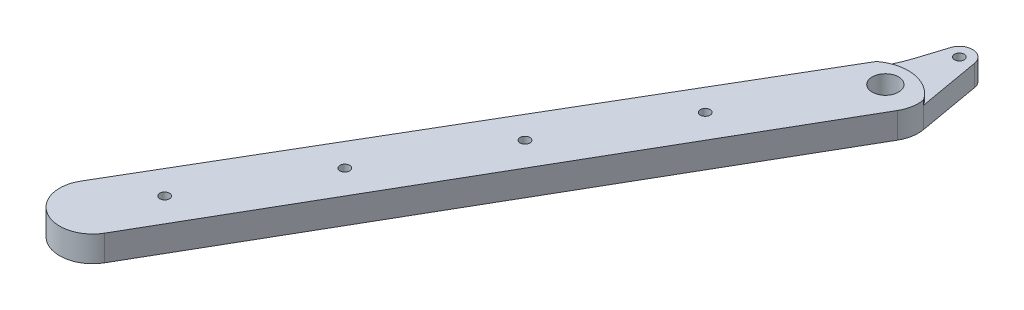
ISO-10303-21;
HEADER;
FILE_DESCRIPTION(('STEP AP214'),'2;1');
FILE_NAME('part.step','',(''),(''),'','','');
FILE_SCHEMA(('AUTOMOTIVE_DESIGN { 1 0 10303 214 1 1 1 1 }'));
ENDSEC;
DATA;
#1=APPLICATION_CONTEXT('core data for automotive mechanical design processes');
#2=APPLICATION_PROTOCOL_DEFINITION('international standard','automotive_design',2000,#1);
#3=PRODUCT_CONTEXT('',#1,'mechanical');
#4=PRODUCT('Part','Part','',(#3));
#5=PRODUCT_RELATED_PRODUCT_CATEGORY('part','',(#4));
#6=PRODUCT_DEFINITION_FORMATION('','',#4);
#7=PRODUCT_DEFINITION_CONTEXT('part definition',#1,'design');
#8=PRODUCT_DEFINITION('design','',#6,#7);
#9=PRODUCT_DEFINITION_SHAPE('','',#8);
#10=(LENGTH_UNIT() NAMED_UNIT(*) SI_UNIT(.MILLI.,.METRE.));
#11=(NAMED_UNIT(*) PLANE_ANGLE_UNIT() SI_UNIT($,.RADIAN.));
#12=(NAMED_UNIT(*) SI_UNIT($,.STERADIAN.) SOLID_ANGLE_UNIT());
#13=UNCERTAINTY_MEASURE_WITH_UNIT(LENGTH_MEASURE(1.E-05),#10,'distance_accuracy_value','');
#14=(GEOMETRIC_REPRESENTATION_CONTEXT(3) GLOBAL_UNCERTAINTY_ASSIGNED_CONTEXT((#13)) GLOBAL_UNIT_ASSIGNED_CONTEXT((#10,
#11,#12)) REPRESENTATION_CONTEXT('',''));
#15=CARTESIAN_POINT('',(0.,0.,0.));
#16=DIRECTION('',(0.,0.,1.));
#17=DIRECTION('',(1.,0.,0.));
#18=AXIS2_PLACEMENT_3D('',#15,#16,#17);
#19=CARTESIAN_POINT('',(0.,17.01,220.));
#20=DIRECTION('',(0.,-1.,0.));
#21=DIRECTION('',(0.,0.,-1.));
#22=AXIS2_PLACEMENT_3D('',#19,#20,#21);
#23=CYLINDRICAL_SURFACE('',#22,12.5);
#24=CARTESIAN_POINT('',(0.,9.01,220.));
#25=DIRECTION('',(0.,1.,0.));
#26=DIRECTION('',(0.,0.,1.));
#27=AXIS2_PLACEMENT_3D('',#24,#25,#26);
#28=CIRCLE('',#27,12.5);
#29=CARTESIAN_POINT('',(10.8253175473055,9.01,226.25));
#30=VERTEX_POINT('',#29);
#31=CARTESIAN_POINT('',(12.3116997121736,9.01,217.838507414478));
#32=VERTEX_POINT('',#31);
#33=EDGE_CURVE('E351',#30,#32,#28,.T.);
#34=ORIENTED_EDGE('',*,*,#33,.T.);
#35=DIRECTION('',(0.,-1.,0.));
#36=VECTOR('',#35,1.);
#37=CARTESIAN_POINT('',(12.3116997121736,17.01,217.838507414478));
#38=LINE('',#37,#36);
#39=CARTESIAN_POINT('',(12.3116997121736,17.01,217.838507414478));
#40=VERTEX_POINT('',#39);
#41=EDGE_CURVE('E11',#40,#32,#38,.T.);
#42=ORIENTED_EDGE('',*,*,#41,.F.);
#43=DIRECTION('',(0.,-1.,0.));
#44=VECTOR('',#43,1.);
#45=CARTESIAN_POINT('',(12.3116997121736,18.76,217.838507414478));
#46=LINE('',#45,#44);
#47=CARTESIAN_POINT('',(12.3116997121736,18.76,217.838507414478));
#48=VERTEX_POINT('',#47);
#49=EDGE_CURVE('E119',#48,#40,#46,.T.);
#50=ORIENTED_EDGE('',*,*,#49,.F.);
#51=CARTESIAN_POINT('',(0.,18.76,220.));
#52=DIRECTION('',(0.,1.,0.));
#53=DIRECTION('',(0.,0.,1.));
#54=AXIS2_PLACEMENT_3D('',#51,#52,#53);
#55=CIRCLE('',#54,12.5);
#56=CARTESIAN_POINT('',(10.8253175473055,18.76,226.25));
#57=VERTEX_POINT('',#56);
#58=EDGE_CURVE('E174',#57,#48,#55,.T.);
#59=ORIENTED_EDGE('',*,*,#58,.F.);
#60=DIRECTION('',(0.,-1.,0.));
#61=VECTOR('',#60,1.);
#62=CARTESIAN_POINT('',(10.8253175473055,17.01,226.25));
#63=LINE('',#62,#61);
#64=EDGE_CURVE('E111',#57,#30,#63,.T.);
#65=ORIENTED_EDGE('',*,*,#64,.T.);
#66=EDGE_LOOP('',(#34,#42,#50,#59,#65));
#67=FACE_BOUND('',#66,.T.);
#68=ADVANCED_FACE('F41',(#67),#23,.T.);
#69=CARTESIAN_POINT('',(-25.1575001692185,17.01,4.41675409222839));
#70=DIRECTION('',(-0.984935976973884,0.,0.172919406841745));
#71=DIRECTION('',(0.172919406841745,0.,0.984935976973884));
#72=AXIS2_PLACEMENT_3D('',#69,#70,#71);
#73=PLANE('',#72);
#74=DIRECTION('',(-0.172919406841745,0.,-0.984935976973884));
#75=VECTOR('',#74,1.);
#76=CARTESIAN_POINT('',(-25.1575001692185,9.01,4.41675409222839));
#77=LINE('',#76,#75);
#78=CARTESIAN_POINT('',(8.18783469037094,9.01,194.349281431446));
#79=VERTEX_POINT('',#78);
#80=EDGE_CURVE('E392',#32,#79,#77,.T.);
#81=ORIENTED_EDGE('',*,*,#80,.T.);
#82=DIRECTION('',(0.,-1.,0.));
#83=VECTOR('',#82,1.);
#84=CARTESIAN_POINT('',(8.18783469037094,17.01,194.349281431446));
#85=LINE('',#84,#83);
#86=CARTESIAN_POINT('',(8.18783469037094,17.01,194.349281431446));
#87=VERTEX_POINT('',#86);
#88=EDGE_CURVE('E52',#87,#79,#85,.T.);
#89=ORIENTED_EDGE('',*,*,#88,.F.);
#90=DIRECTION('',(-0.172919406841745,0.,-0.984935976973884));
#91=VECTOR('',#90,1.);
#92=CARTESIAN_POINT('',(-25.1575001692185,17.01,4.41675409222839));
#93=LINE('',#92,#91);
#94=EDGE_CURVE('E371',#40,#87,#93,.T.);
#95=ORIENTED_EDGE('',*,*,#94,.F.);
#96=ORIENTED_EDGE('',*,*,#41,.T.);
#97=EDGE_LOOP('',(#81,#89,#95,#96));
#98=FACE_BOUND('',#97,.T.);
#99=ADVANCED_FACE('F475',(#98),#73,.F.);
#100=CARTESIAN_POINT('',(3.26315480550152,17.01,195.213878465655));
#101=DIRECTION('',(0.,-1.,0.));
#102=DIRECTION('',(0.,0.,-1.));
#103=AXIS2_PLACEMENT_3D('',#100,#101,#102);
#104=CYLINDRICAL_SURFACE('',#103,5.00000000000001);
#105=CARTESIAN_POINT('',(3.26315480550152,9.01,195.213878465655));
#106=DIRECTION('',(0.,1.,0.));
#107=DIRECTION('',(0.,0.,1.));
#108=AXIS2_PLACEMENT_3D('',#105,#106,#107);
#109=CIRCLE('',#108,5.00000000000001);
#110=CARTESIAN_POINT('',(-1.50542994823962,9.01,193.710349468133));
#111=VERTEX_POINT('',#110);
#112=EDGE_CURVE('E395',#79,#111,#109,.T.);
#113=ORIENTED_EDGE('',*,*,#112,.T.);
#114=DIRECTION('',(0.,-1.,0.));
#115=VECTOR('',#114,1.);
#116=CARTESIAN_POINT('',(-1.50542994823962,17.01,193.710349468133));
#117=LINE('',#116,#115);
#118=CARTESIAN_POINT('',(-1.50542994823962,17.01,193.710349468133));
#119=VERTEX_POINT('',#118);
#120=EDGE_CURVE('E428',#119,#111,#117,.T.);
#121=ORIENTED_EDGE('',*,*,#120,.F.);
#122=CARTESIAN_POINT('',(3.26315480550152,17.01,195.213878465655));
#123=DIRECTION('',(0.,1.,0.));
#124=DIRECTION('',(0.,0.,1.));
#125=AXIS2_PLACEMENT_3D('',#122,#123,#124);
#126=CIRCLE('',#125,5.00000000000001);
#127=EDGE_CURVE('E377',#87,#119,#126,.T.);
#128=ORIENTED_EDGE('',*,*,#127,.F.);
#129=ORIENTED_EDGE('',*,*,#88,.T.);
#130=EDGE_LOOP('',(#113,#121,#128,#129));
#131=FACE_BOUND('',#130,.T.);
#132=ADVANCED_FACE('F479',(#131),#104,.T.);
#133=CARTESIAN_POINT('',(54.184542982187,17.01,17.0843207782449));
#134=DIRECTION('',(0.953716950748227,0.,0.300705799504274));
#135=DIRECTION('',(0.300705799504274,0.,-0.953716950748227));
#136=AXIS2_PLACEMENT_3D('',#133,#134,#135);
#137=PLANE('',#136);
#138=DIRECTION('',(-0.300705799504274,0.,0.953716950748227));
#139=VECTOR('',#138,1.);
#140=CARTESIAN_POINT('',(54.184542982187,9.01,17.0843207782449));
#141=LINE('',#140,#139);
#142=CARTESIAN_POINT('',(-4.71126086938447,9.01,203.877946154892));
#143=VERTEX_POINT('',#142);
#144=EDGE_CURVE('E398',#111,#143,#141,.T.);
#145=ORIENTED_EDGE('',*,*,#144,.T.);
#146=DIRECTION('',(0.,-1.,0.));
#147=VECTOR('',#146,1.);
#148=CARTESIAN_POINT('',(-4.71126086938447,17.01,203.877946154892));
#149=LINE('',#148,#147);
#150=CARTESIAN_POINT('',(-4.71126086938447,17.01,203.877946154892));
#151=VERTEX_POINT('',#150);
#152=EDGE_CURVE('E424',#151,#143,#149,.T.);
#153=ORIENTED_EDGE('',*,*,#152,.F.);
#154=DIRECTION('',(-0.300705799504274,0.,0.953716950748227));
#155=VECTOR('',#154,1.);
#156=CARTESIAN_POINT('',(54.184542982187,17.01,17.0843207782449));
#157=LINE('',#156,#155);
#158=EDGE_CURVE('E61',#119,#151,#157,.T.);
#159=ORIENTED_EDGE('',*,*,#158,.F.);
#160=ORIENTED_EDGE('',*,*,#120,.T.);
#161=EDGE_LOOP('',(#145,#153,#159,#160));
#162=FACE_BOUND('',#161,.T.);
#163=ADVANCED_FACE('F493',(#162),#137,.F.);
#164=CARTESIAN_POINT('',(-52.3971084067959,17.01,188.842656179678));
#165=DIRECTION('',(0.,-1.,0.));
#166=DIRECTION('',(0.,0.,-1.));
#167=AXIS2_PLACEMENT_3D('',#164,#165,#166);
#168=CYLINDRICAL_SURFACE('',#167,50.);
#169=CARTESIAN_POINT('',(-52.3971084067959,9.01,188.842656179678));
#170=DIRECTION('',(0.,1.,0.));
#171=DIRECTION('',(0.,0.,1.));
#172=AXIS2_PLACEMENT_3D('',#169,#170,#171);
#173=CIRCLE('',#172,50.);
#174=CARTESIAN_POINT('',(-9.2718757914107,9.01,214.145112816711));
#175=VERTEX_POINT('',#174);
#176=EDGE_CURVE('E401',#143,#175,#173,.F.);
#177=ORIENTED_EDGE('',*,*,#176,.T.);
#178=DIRECTION('',(0.,-1.,0.));
#179=VECTOR('',#178,1.);
#180=CARTESIAN_POINT('',(-9.2718757914107,17.01,214.145112816711));
#181=LINE('',#180,#179);
#182=CARTESIAN_POINT('',(-9.27187579141071,17.01,214.145112816711));
#183=VERTEX_POINT('',#182);
#184=EDGE_CURVE('E421',#183,#175,#181,.T.);
#185=ORIENTED_EDGE('',*,*,#184,.F.);
#186=CARTESIAN_POINT('',(-52.3971084067959,17.01,188.842656179678));
#187=DIRECTION('',(0.,1.,0.));
#188=DIRECTION('',(0.,0.,1.));
#189=AXIS2_PLACEMENT_3D('',#186,#187,#188);
#190=CIRCLE('',#189,50.);
#191=EDGE_CURVE('E383',#151,#183,#190,.F.);
#192=ORIENTED_EDGE('',*,*,#191,.F.);
#193=ORIENTED_EDGE('',*,*,#152,.T.);
#194=EDGE_LOOP('',(#177,#185,#192,#193));
#195=FACE_BOUND('',#194,.T.);
#196=ADVANCED_FACE('F491',(#195),#168,.F.);
#197=CARTESIAN_POINT('',(86.5703790875275,17.01,50.7926132816309));
#198=DIRECTION('',(0.862504652307704,0.,0.506049132740652));
#199=DIRECTION('',(0.506049132740652,0.,-0.862504652307705));
#200=AXIS2_PLACEMENT_3D('',#197,#198,#199);
#201=PLANE('',#200);
#202=DIRECTION('',(-0.506049132740652,0.,0.862504652307705));
#203=VECTOR('',#202,1.);
#204=CARTESIAN_POINT('',(86.5703790875275,9.01,50.7926132816309));
#205=LINE('',#204,#203);
#206=CARTESIAN_POINT('',(-120.825317547306,9.01,404.275588832576));
#207=VERTEX_POINT('',#206);
#208=EDGE_CURVE('E404',#175,#207,#205,.T.);
#209=ORIENTED_EDGE('',*,*,#208,.T.);
#210=DIRECTION('',(0.,-1.,0.));
#211=VECTOR('',#210,1.);
#212=CARTESIAN_POINT('',(-120.825317547306,17.01,404.275588832576));
#213=LINE('',#212,#211);
#214=CARTESIAN_POINT('',(-120.825317547306,18.76,404.275588832576));
#215=VERTEX_POINT('',#214);
#216=EDGE_CURVE('E164',#215,#207,#213,.T.);
#217=ORIENTED_EDGE('',*,*,#216,.F.);
#218=DIRECTION('',(-0.506049132740652,0.,0.862504652307704));
#219=VECTOR('',#218,1.);
#220=CARTESIAN_POINT('',(86.5703790875275,18.76,50.7926132816309));
#221=LINE('',#220,#219);
#222=CARTESIAN_POINT('',(-9.27187579141071,18.76,214.145112816711));
#223=VERTEX_POINT('',#222);
#224=EDGE_CURVE('E161',#223,#215,#221,.T.);
#225=ORIENTED_EDGE('',*,*,#224,.F.);
#226=DIRECTION('',(0.,-1.,0.));
#227=VECTOR('',#226,1.);
#228=CARTESIAN_POINT('',(-9.27187579141071,18.76,214.145112816711));
#229=LINE('',#228,#227);
#230=EDGE_CURVE('E149',#223,#183,#229,.T.);
#231=ORIENTED_EDGE('',*,*,#230,.T.);
#232=ORIENTED_EDGE('',*,*,#184,.T.);
#233=EDGE_LOOP('',(#209,#217,#225,#231,#232));
#234=FACE_BOUND('',#233,.T.);
#235=ADVANCED_FACE('F162',(#234),#201,.F.);
#236=CARTESIAN_POINT('',(-110.,17.01,410.525588832576));
#237=DIRECTION('',(0.,-1.,0.));
#238=DIRECTION('',(0.,0.,-1.));
#239=AXIS2_PLACEMENT_3D('',#236,#237,#238);
#240=CYLINDRICAL_SURFACE('',#239,12.5000000000001);
#241=CARTESIAN_POINT('',(-110.,9.01,410.525588832576));
#242=DIRECTION('',(0.,1.,0.));
#243=DIRECTION('',(0.,0.,1.));
#244=AXIS2_PLACEMENT_3D('',#241,#242,#243);
#245=CIRCLE('',#244,12.5000000000001);
#246=CARTESIAN_POINT('',(-99.1746824526947,9.01,416.775588832576));
#247=VERTEX_POINT('',#246);
#248=EDGE_CURVE('E407',#207,#247,#245,.T.);
#249=ORIENTED_EDGE('',*,*,#248,.T.);
#250=DIRECTION('',(0.,-1.,0.));
#251=VECTOR('',#250,1.);
#252=CARTESIAN_POINT('',(-99.1746824526947,17.01,416.775588832576));
#253=LINE('',#252,#251);
#254=CARTESIAN_POINT('',(-99.1746824526947,18.76,416.775588832576));
#255=VERTEX_POINT('',#254);
#256=EDGE_CURVE('E103',#255,#247,#253,.T.);
#257=ORIENTED_EDGE('',*,*,#256,.F.);
#258=CARTESIAN_POINT('',(-110.,18.76,410.525588832576));
#259=DIRECTION('',(0.,1.,0.));
#260=DIRECTION('',(0.,0.,1.));
#261=AXIS2_PLACEMENT_3D('',#258,#259,#260);
#262=CIRCLE('',#261,12.5000000000001);
#263=EDGE_CURVE('E169',#215,#255,#262,.T.);
#264=ORIENTED_EDGE('',*,*,#263,.F.);
#265=ORIENTED_EDGE('',*,*,#216,.T.);
#266=EDGE_LOOP('',(#249,#257,#264,#265));
#267=FACE_BOUND('',#266,.T.);
#268=ADVANCED_FACE('F468',(#267),#240,.T.);
#269=CARTESIAN_POINT('',(0.,17.01,220.));
#270=DIRECTION('',(0.,-1.,0.));
#271=DIRECTION('',(0.,0.,-1.));
#272=AXIS2_PLACEMENT_3D('',#269,#270,#271);
#273=CYLINDRICAL_SURFACE('',#272,5.);
#274=CARTESIAN_POINT('',(0.,9.01,220.));
#275=DIRECTION('',(0.,1.,0.));
#276=DIRECTION('',(0.,0.,1.));
#277=AXIS2_PLACEMENT_3D('',#274,#275,#276);
#278=CIRCLE('',#277,5.);
#279=CARTESIAN_POINT('',(4.8489885172762,9.01,221.21955334419));
#280=VERTEX_POINT('',#279);
#281=CARTESIAN_POINT('',(1.21730572604472,9.01,224.849553254614));
#282=VERTEX_POINT('',#281);
#283=EDGE_CURVE('E158',#280,#282,#278,.T.);
#284=ORIENTED_EDGE('',*,*,#283,.F.);
#285=DIRECTION('',(0.,-1.,0.));
#286=VECTOR('',#285,1.);
#287=CARTESIAN_POINT('',(4.8489885172762,17.01,221.21955334419));
#288=LINE('',#287,#286);
#289=CARTESIAN_POINT('',(4.84898851727622,18.76,221.219553344189));
#290=VERTEX_POINT('',#289);
#291=EDGE_CURVE('E308',#290,#280,#288,.T.);
#292=ORIENTED_EDGE('',*,*,#291,.F.);
#293=CARTESIAN_POINT('',(0.,18.76,220.));
#294=DIRECTION('',(0.,1.,0.));
#295=DIRECTION('',(0.,0.,1.));
#296=AXIS2_PLACEMENT_3D('',#293,#294,#295);
#297=CIRCLE('',#296,5.);
#298=CARTESIAN_POINT('',(1.21730572604443,18.76,224.849553254614));
#299=VERTEX_POINT('',#298);
#300=EDGE_CURVE('E442',#299,#290,#297,.F.);
#301=ORIENTED_EDGE('',*,*,#300,.F.);
#302=DIRECTION('',(0.,-1.,0.));
#303=VECTOR('',#302,1.);
#304=CARTESIAN_POINT('',(1.21730572604472,17.01,224.849553254614));
#305=LINE('',#304,#303);
#306=EDGE_CURVE('E327',#299,#282,#305,.T.);
#307=ORIENTED_EDGE('',*,*,#306,.T.);
#308=EDGE_LOOP('',(#284,#292,#301,#307));
#309=FACE_BOUND('',#308,.T.);
#310=ADVANCED_FACE('F43',(#309),#273,.F.);
#311=CARTESIAN_POINT('',(8.14532087740122E-08,17.01,215.5));
#312=CARTESIAN_POINT('',(0.393674247111127,17.01,215.47713661079));
#313=CARTESIAN_POINT('',(0.782899626065433,17.01,215.504477464915));
#314=CARTESIAN_POINT('',(1.36015662743047,17.01,215.61975562254));
#315=CARTESIAN_POINT('',(1.55112333452106,17.01,215.670842226849));
#316=CARTESIAN_POINT('',(1.92138585302806,17.01,215.795656059319));
#317=CARTESIAN_POINT('',(2.10189722354922,17.01,215.869587959099));
#318=CARTESIAN_POINT('',(2.45365502635701,17.01,216.040564492944));
#319=CARTESIAN_POINT('',(2.62591599390359,17.01,216.138373003099));
#320=CARTESIAN_POINT('',(2.95321023785839,17.01,216.353010798462));
#321=CARTESIAN_POINT('',(3.1088432435939,17.01,216.4699415759));
#322=CARTESIAN_POINT('',(3.40439744065445,17.01,216.722647388374));
#323=CARTESIAN_POINT('',(3.54444963091288,17.01,216.858265307395));
#324=CARTESIAN_POINT('',(3.80930672153731,17.01,217.147788266892));
#325=CARTESIAN_POINT('',(3.93329056146768,17.01,217.30126333938));
#326=CARTESIAN_POINT('',(4.27247406254198,17.01,217.77751063126));
#327=CARTESIAN_POINT('',(4.45910337531629,17.01,218.120359774844));
#328=CARTESIAN_POINT('',(4.74797141825617,17.01,218.852518731862));
#329=CARTESIAN_POINT('',(4.84538651657294,17.01,219.228899601674));
#330=CARTESIAN_POINT('',(4.92299304777766,17.01,219.808482124788));
#331=CARTESIAN_POINT('',(4.93712204506854,17.01,220.005512498699));
#332=CARTESIAN_POINT('',(4.94217254687859,17.01,220.397594198402));
#333=CARTESIAN_POINT('',(4.93326900863412,17.01,220.592326974989));
#334=CARTESIAN_POINT('',(4.8730771674928,17.01,221.172693236754));
#335=CARTESIAN_POINT('',(4.78769621433537,17.01,221.557248222708));
#336=CARTESIAN_POINT('',(4.6575223437292,17.01,221.929208967454));
#337=B_SPLINE_CURVE_WITH_KNOTS('',3,(#311,#312,#313,#314,#315,#316,#317,#318,#319,#320,#321,
#322,#323,#324,#325,#326,#327,#328,#329,#330,#331,#332,#333,#334,#335,#336),.UNSPECIFIED.,.F.,
.F.,(4,2,2,2,2,2,2,2,2,2,2,2,4),(0.,0.125000000000003,0.187500000000005,0.250000000000006,
0.312500000000008,0.37500000000001,0.437500000000011,0.500000000000013,0.625000000000016,
0.75000000000002,0.812500000000017,0.875000000000014,1.),.UNSPECIFIED.);
#338=DIRECTION('',(0.,-1.,0.));
#339=VECTOR('',#338,1.);
#340=SURFACE_OF_LINEAR_EXTRUSION('',#337,#339);
#341=CARTESIAN_POINT('',(4.8489885172762,9.01,221.21955334419));
#342=CARTESIAN_POINT('',(4.80273711494687,9.01,221.459358237997));
#343=CARTESIAN_POINT('',(4.73887761536844,9.01000000000001,221.696743210025));
#344=CARTESIAN_POINT('',(4.6575223437292,9.01000000000001,221.929208967454));
#345=B_SPLINE_CURVE_WITH_KNOTS('',3,(#341,#342,#343,#344),.UNSPECIFIED.,.F.,.F.,(4,4),
(0.921878262453523,1.),.UNSPECIFIED.);
#346=CARTESIAN_POINT('',(4.6575223437292,9.01000000000001,221.929208967454));
#347=VERTEX_POINT('',#346);
#348=EDGE_CURVE('E275',#280,#347,#345,.T.);
#349=ORIENTED_EDGE('',*,*,#348,.T.);
#350=DIRECTION('',(0.,-1.,0.));
#351=VECTOR('',#350,1.);
#352=CARTESIAN_POINT('',(4.6575223437292,17.01,221.929208967454));
#353=LINE('',#352,#351);
#354=CARTESIAN_POINT('',(4.65752234372919,18.76,221.929208967454));
#355=VERTEX_POINT('',#354);
#356=EDGE_CURVE('E315',#355,#347,#353,.T.);
#357=ORIENTED_EDGE('',*,*,#356,.F.);
#358=CARTESIAN_POINT('',(4.6575223437292,18.76,221.929208967454));
#359=CARTESIAN_POINT('',(4.73887761536852,18.76,221.696743210025));
#360=CARTESIAN_POINT('',(4.80273711494699,18.76,221.459358237996));
#361=CARTESIAN_POINT('',(4.84898851727633,18.76,221.219553344189));
#362=B_SPLINE_CURVE_WITH_KNOTS('',3,(#358,#359,#360,#361),.UNSPECIFIED.,.F.,.F.,(4,4),
(0.92187826245345,1.),.UNSPECIFIED.);
#363=EDGE_CURVE('E444',#290,#355,#362,.F.);
#364=ORIENTED_EDGE('',*,*,#363,.F.);
#365=ORIENTED_EDGE('',*,*,#291,.T.);
#366=EDGE_LOOP('',(#349,#357,#364,#365));
#367=FACE_BOUND('',#366,.T.);
#368=ADVANCED_FACE('F245',(#367),#340,.F.);
#369=CARTESIAN_POINT('',(4.65752234372919,17.01,221.929208967454));
#370=CARTESIAN_POINT('',(4.40459758158712,17.01,222.539823344036));
#371=CARTESIAN_POINT('',(4.03057160196373,17.01,223.098818660424));
#372=CARTESIAN_POINT('',(3.09913283328678,17.01,224.030330037403));
#373=CARTESIAN_POINT('',(2.5398232703786,17.01,224.40459762406));
#374=CARTESIAN_POINT('',(1.92920888956644,17.01,224.657522375991));
#375=B_SPLINE_CURVE_WITH_KNOTS('',3,(#369,#370,#371,#372,#373,#374),.UNSPECIFIED.,.F.,.F.,(4,2,
4),(0.,0.5,1.),.UNSPECIFIED.);
#376=DIRECTION('',(0.,-1.,0.));
#377=VECTOR('',#376,1.);
#378=SURFACE_OF_LINEAR_EXTRUSION('',#375,#377);
#379=CARTESIAN_POINT('',(4.65752234372919,9.01,221.929208967454));
#380=CARTESIAN_POINT('',(4.40459758158712,9.01,222.539823344036));
#381=CARTESIAN_POINT('',(4.03057160196373,9.01,223.098818660424));
#382=CARTESIAN_POINT('',(3.09913283328678,9.01,224.030330037403));
#383=CARTESIAN_POINT('',(2.5398232703786,9.01,224.40459762406));
#384=CARTESIAN_POINT('',(1.92920888956644,9.01,224.657522375991));
#385=B_SPLINE_CURVE_WITH_KNOTS('',3,(#379,#380,#381,#382,#383,#384),.UNSPECIFIED.,.F.,.F.,(4,2,
4),(0.,0.5,1.),.UNSPECIFIED.);
#386=CARTESIAN_POINT('',(1.92920888956643,9.01,224.657522375991));
#387=VERTEX_POINT('',#386);
#388=EDGE_CURVE('E334',#347,#387,#385,.T.);
#389=ORIENTED_EDGE('',*,*,#388,.T.);
#390=DIRECTION('',(0.,-1.,0.));
#391=VECTOR('',#390,1.);
#392=CARTESIAN_POINT('',(1.92920888956643,17.01,224.657522375991));
#393=LINE('',#392,#391);
#394=CARTESIAN_POINT('',(1.92920888956643,18.76,224.657522375991));
#395=VERTEX_POINT('',#394);
#396=EDGE_CURVE('E322',#395,#387,#393,.T.);
#397=ORIENTED_EDGE('',*,*,#396,.F.);
#398=CARTESIAN_POINT('',(1.92920888956644,18.76,224.657522375991));
#399=CARTESIAN_POINT('',(2.5398232703786,18.76,224.40459762406));
#400=CARTESIAN_POINT('',(3.09913283328678,18.76,224.030330037403));
#401=CARTESIAN_POINT('',(4.03057160196373,18.76,223.098818660424));
#402=CARTESIAN_POINT('',(4.40459758158712,18.76,222.539823344036));
#403=CARTESIAN_POINT('',(4.65752234372919,18.76,221.929208967454));
#404=B_SPLINE_CURVE_WITH_KNOTS('',3,(#398,#399,#400,#401,#402,#403),.UNSPECIFIED.,.F.,.F.,(4,2,
4),(0.,0.5,1.),.UNSPECIFIED.);
#405=EDGE_CURVE('E192',#355,#395,#404,.F.);
#406=ORIENTED_EDGE('',*,*,#405,.F.);
#407=ORIENTED_EDGE('',*,*,#356,.T.);
#408=EDGE_LOOP('',(#389,#397,#406,#407));
#409=FACE_BOUND('',#408,.T.);
#410=ADVANCED_FACE('F249',(#409),#378,.F.);
#411=CARTESIAN_POINT('',(106.088111963594,17.01,61.2500000000002));
#412=DIRECTION('',(0.866025403784438,0.,0.500000000000001));
#413=DIRECTION('',(0.500000000000001,0.,-0.866025403784438));
#414=AXIS2_PLACEMENT_3D('',#411,#412,#413);
#415=PLANE('',#414);
#416=DIRECTION('',(-0.500000000000001,0.,0.866025403784438));
#417=VECTOR('',#416,1.);
#418=CARTESIAN_POINT('',(106.088111963594,9.01,61.2500000000002));
#419=LINE('',#418,#417);
#420=EDGE_CURVE('E410',#30,#247,#419,.T.);
#421=ORIENTED_EDGE('',*,*,#420,.F.);
#422=ORIENTED_EDGE('',*,*,#64,.F.);
#423=DIRECTION('',(0.500000000000001,0.,-0.866025403784438));
#424=VECTOR('',#423,1.);
#425=CARTESIAN_POINT('',(106.088111963594,18.76,61.2500000000002));
#426=LINE('',#425,#424);
#427=EDGE_CURVE('E185',#255,#57,#426,.T.);
#428=ORIENTED_EDGE('',*,*,#427,.F.);
#429=ORIENTED_EDGE('',*,*,#256,.T.);
#430=EDGE_LOOP('',(#421,#422,#428,#429));
#431=FACE_BOUND('',#430,.T.);
#432=ADVANCED_FACE('F364',(#431),#415,.T.);
#433=CARTESIAN_POINT('',(1.92920888956643,17.01,224.657522375991));
#434=CARTESIAN_POINT('',(1.55708028077786,17.01,224.787754986436));
#435=CARTESIAN_POINT('',(1.1756496879371,17.01,224.872830014288));
#436=CARTESIAN_POINT('',(0.589716389669111,17.01,224.933509947123));
#437=CARTESIAN_POINT('',(0.392424617913908,17.01,224.942265752075));
#438=CARTESIAN_POINT('',(0.00234436840610393,17.01,224.936917996887));
#439=CARTESIAN_POINT('',(-0.191587762111237,17.01,224.922969038706));
#440=CARTESIAN_POINT('',(-0.769891224358686,17.01,224.845577701877));
#441=CARTESIAN_POINT('',(-1.15541961938492,17.01,224.745215036917));
#442=CARTESIAN_POINT('',(-1.87978506748111,17.01,224.458666386559));
#443=CARTESIAN_POINT('',(-2.22285602980343,17.01,224.272653243378));
#444=CARTESIAN_POINT('',(-2.86429967842671,17.01,223.814931257155));
#445=CARTESIAN_POINT('',(-3.15125915001857,17.01,223.552070453287));
#446=CARTESIAN_POINT('',(-3.5314215058727,17.01,223.107148787821));
#447=CARTESIAN_POINT('',(-3.65017610330814,17.01,222.94880680171));
#448=CARTESIAN_POINT('',(-3.86496715109106,17.01,222.62035248895));
#449=CARTESIAN_POINT('',(-4.05694452562091,17.01,222.281111724364));
#450=CARTESIAN_POINT('',(-4.20454967788705,17.01,221.920891486958));
#451=CARTESIAN_POINT('',(-4.32950923640357,17.01,221.549964266798));
#452=CARTESIAN_POINT('',(-4.38067521376912,17.01,221.358279740681));
#453=CARTESIAN_POINT('',(-4.49542182954985,17.01,220.782840120861));
#454=CARTESIAN_POINT('',(-4.5228860382563,17.01,220.394064038029));
#455=CARTESIAN_POINT('',(-4.49999999999997,17.01,220.));
#456=B_SPLINE_CURVE_WITH_KNOTS('',3,(#433,#434,#435,#436,#437,#438,#439,#440,#441,#442,#443,
#444,#445,#446,#447,#448,#449,#450,#451,#452,#453,#454,#455),.UNSPECIFIED.,.F.,.F.,(4,2,2,2,2,2,
2,2,1,2,2,4),(0.,0.125000000000001,0.187500000000001,0.250000000000002,0.375000000000001,
0.500000000000001,0.625,0.6875,0.75,0.8125,0.875,1.),.UNSPECIFIED.);
#457=DIRECTION('',(0.,-1.,0.));
#458=VECTOR('',#457,1.);
#459=SURFACE_OF_LINEAR_EXTRUSION('',#456,#458);
#460=CARTESIAN_POINT('',(1.92920888956643,9.01,224.657522375991));
#461=CARTESIAN_POINT('',(1.69556560356501,9.01,224.739289739021));
#462=CARTESIAN_POINT('',(1.45825544275279,9.01,224.80325582426));
#463=CARTESIAN_POINT('',(1.21730572604474,9.01,224.849553254614));
#464=B_SPLINE_CURVE_WITH_KNOTS('',3,(#460,#461,#462,#463),.UNSPECIFIED.,.F.,.F.,(4,4),(0.,
0.0784820356737758),.UNSPECIFIED.);
#465=EDGE_CURVE('E344',#387,#282,#464,.T.);
#466=ORIENTED_EDGE('',*,*,#465,.T.);
#467=ORIENTED_EDGE('',*,*,#306,.F.);
#468=CARTESIAN_POINT('',(1.21730572604442,18.76,224.849553254614));
#469=CARTESIAN_POINT('',(1.45825544275258,18.76,224.803255824261));
#470=CARTESIAN_POINT('',(1.69556560356491,18.76,224.739289739022));
#471=CARTESIAN_POINT('',(1.92920888956643,18.76,224.657522375991));
#472=B_SPLINE_CURVE_WITH_KNOTS('',3,(#468,#469,#470,#471),.UNSPECIFIED.,.F.,.F.,(4,4),(0.,
0.07848203567381),.UNSPECIFIED.);
#473=EDGE_CURVE('E189',#395,#299,#472,.F.);
#474=ORIENTED_EDGE('',*,*,#473,.F.);
#475=ORIENTED_EDGE('',*,*,#396,.T.);
#476=EDGE_LOOP('',(#466,#467,#474,#475));
#477=FACE_BOUND('',#476,.T.);
#478=ADVANCED_FACE('F347',(#477),#459,.F.);
#479=CARTESIAN_POINT('',(3.26315480550152,17.01,195.213878465655));
#480=DIRECTION('',(0.,-1.,0.));
#481=DIRECTION('',(0.,0.,-1.));
#482=AXIS2_PLACEMENT_3D('',#479,#480,#481);
#483=CYLINDRICAL_SURFACE('',#482,1.84999999999997);
#484=CARTESIAN_POINT('',(3.26315480550152,17.01,195.213878465655));
#485=DIRECTION('',(0.,1.,0.));
#486=DIRECTION('',(0.,0.,1.));
#487=AXIS2_PLACEMENT_3D('',#484,#485,#486);
#488=CIRCLE('',#487,1.84999999999997);
#489=CARTESIAN_POINT('',(3.26315480550152,17.01,197.063878465655));
#490=VERTEX_POINT('',#489);
#491=EDGE_CURVE('E386',#490,#490,#488,.T.);
#492=ORIENTED_EDGE('',*,*,#491,.T.);
#493=EDGE_LOOP('',(#492));
#494=FACE_BOUND('',#493,.T.);
#495=CARTESIAN_POINT('',(3.26315480550152,9.01,195.213878465655));
#496=DIRECTION('',(0.,1.,0.));
#497=DIRECTION('',(0.,0.,1.));
#498=AXIS2_PLACEMENT_3D('',#495,#496,#497);
#499=CIRCLE('',#498,1.84999999999997);
#500=CARTESIAN_POINT('',(3.26315480550152,9.01,197.063878465655));
#501=VERTEX_POINT('',#500);
#502=EDGE_CURVE('E378',#501,#501,#499,.T.);
#503=ORIENTED_EDGE('',*,*,#502,.F.);
#504=EDGE_LOOP('',(#503));
#505=FACE_BOUND('',#504,.T.);
#506=ADVANCED_FACE('F293',(#494,#505),#483,.F.);
#507=CARTESIAN_POINT('',(0.,17.01,0.));
#508=DIRECTION('',(0.,1.,0.));
#509=DIRECTION('',(0.,0.,1.));
#510=AXIS2_PLACEMENT_3D('',#507,#508,#509);
#511=PLANE('',#510);
#512=ORIENTED_EDGE('',*,*,#191,.T.);
#513=CARTESIAN_POINT('',(-0.209475334172437,17.01,226.098057974815));
#514=DIRECTION('',(0.,1.,0.));
#515=DIRECTION('',(0.,0.,1.));
#516=AXIS2_PLACEMENT_3D('',#513,#514,#515);
#517=CIRCLE('',#516,15.);
#518=EDGE_CURVE('E154',#183,#40,#517,.F.);
#519=ORIENTED_EDGE('',*,*,#518,.T.);
#520=ORIENTED_EDGE('',*,*,#94,.T.);
#521=ORIENTED_EDGE('',*,*,#127,.T.);
#522=ORIENTED_EDGE('',*,*,#158,.T.);
#523=EDGE_LOOP('',(#512,#519,#520,#521,#522));
#524=FACE_BOUND('',#523,.T.);
#525=ORIENTED_EDGE('',*,*,#491,.F.);
#526=EDGE_LOOP('',(#525));
#527=FACE_BOUND('',#526,.T.);
#528=ADVANCED_FACE('F291',(#524,#527),#511,.T.);
#529=CARTESIAN_POINT('',(0.,9.01,0.));
#530=DIRECTION('',(0.,1.,0.));
#531=DIRECTION('',(0.,0.,1.));
#532=AXIS2_PLACEMENT_3D('',#529,#530,#531);
#533=PLANE('',#532);
#534=CARTESIAN_POINT('',(-25.,9.01,263.301270189222));
#535=DIRECTION('',(0.,1.,0.));
#536=DIRECTION('',(0.,0.,1.));
#537=AXIS2_PLACEMENT_3D('',#534,#535,#536);
#538=CIRCLE('',#537,1.84999999999999);
#539=CARTESIAN_POINT('',(-25.,9.01,265.151270189222));
#540=VERTEX_POINT('',#539);
#541=EDGE_CURVE('E178',#540,#540,#538,.T.);
#542=ORIENTED_EDGE('',*,*,#541,.T.);
#543=EDGE_LOOP('',(#542));
#544=FACE_BOUND('',#543,.T.);
#545=CARTESIAN_POINT('',(-50.,9.01,306.602540378444));
#546=DIRECTION('',(0.,1.,0.));
#547=DIRECTION('',(0.,0.,1.));
#548=AXIS2_PLACEMENT_3D('',#545,#546,#547);
#549=CIRCLE('',#548,1.85);
#550=CARTESIAN_POINT('',(-50.,9.01,308.452540378444));
#551=VERTEX_POINT('',#550);
#552=EDGE_CURVE('E716',#551,#551,#549,.T.);
#553=ORIENTED_EDGE('',*,*,#552,.T.);
#554=EDGE_LOOP('',(#553));
#555=FACE_BOUND('',#554,.T.);
#556=CARTESIAN_POINT('',(-75.0000000000001,9.01,349.903810567666));
#557=DIRECTION('',(0.,1.,0.));
#558=DIRECTION('',(0.,0.,1.));
#559=AXIS2_PLACEMENT_3D('',#556,#557,#558);
#560=CIRCLE('',#559,1.85);
#561=CARTESIAN_POINT('',(-75.0000000000001,9.01,351.753810567666));
#562=VERTEX_POINT('',#561);
#563=EDGE_CURVE('E724',#562,#562,#560,.T.);
#564=ORIENTED_EDGE('',*,*,#563,.T.);
#565=EDGE_LOOP('',(#564));
#566=FACE_BOUND('',#565,.T.);
#567=CARTESIAN_POINT('',(-100.,9.01,393.205080756888));
#568=DIRECTION('',(0.,1.,0.));
#569=DIRECTION('',(0.,0.,1.));
#570=AXIS2_PLACEMENT_3D('',#567,#568,#569);
#571=CIRCLE('',#570,1.84999999999999);
#572=CARTESIAN_POINT('',(-100.,9.01,395.055080756888));
#573=VERTEX_POINT('',#572);
#574=EDGE_CURVE('E730',#573,#573,#571,.T.);
#575=ORIENTED_EDGE('',*,*,#574,.T.);
#576=EDGE_LOOP('',(#575));
#577=FACE_BOUND('',#576,.T.);
#578=ORIENTED_EDGE('',*,*,#283,.T.);
#579=ORIENTED_EDGE('',*,*,#465,.F.);
#580=ORIENTED_EDGE('',*,*,#388,.F.);
#581=ORIENTED_EDGE('',*,*,#348,.F.);
#582=EDGE_LOOP('',(#578,#579,#580,#581));
#583=FACE_BOUND('',#582,.T.);
#584=ORIENTED_EDGE('',*,*,#33,.F.);
#585=ORIENTED_EDGE('',*,*,#420,.T.);
#586=ORIENTED_EDGE('',*,*,#248,.F.);
#587=ORIENTED_EDGE('',*,*,#208,.F.);
#588=ORIENTED_EDGE('',*,*,#176,.F.);
#589=ORIENTED_EDGE('',*,*,#144,.F.);
#590=ORIENTED_EDGE('',*,*,#112,.F.);
#591=ORIENTED_EDGE('',*,*,#80,.F.);
#592=EDGE_LOOP('',(#584,#585,#586,#587,#588,#589,#590,#591));
#593=FACE_BOUND('',#592,.T.);
#594=ORIENTED_EDGE('',*,*,#502,.T.);
#595=EDGE_LOOP('',(#594));
#596=FACE_BOUND('',#595,.T.);
#597=ADVANCED_FACE('F282',(#544,#555,#566,#577,#583,#593,#596),#533,.F.);
#598=CARTESIAN_POINT('',(-0.209475334172437,18.76,226.098057974815));
#599=DIRECTION('',(0.,-1.,0.));
#600=DIRECTION('',(0.,0.,-1.));
#601=AXIS2_PLACEMENT_3D('',#598,#599,#600);
#602=CYLINDRICAL_SURFACE('',#601,15.);
#603=ORIENTED_EDGE('',*,*,#518,.F.);
#604=ORIENTED_EDGE('',*,*,#230,.F.);
#605=CARTESIAN_POINT('',(-0.209475334172437,18.76,226.098057974815));
#606=DIRECTION('',(0.,1.,0.));
#607=DIRECTION('',(0.,0.,1.));
#608=AXIS2_PLACEMENT_3D('',#605,#606,#607);
#609=CIRCLE('',#608,15.);
#610=EDGE_CURVE('E153',#223,#48,#609,.F.);
#611=ORIENTED_EDGE('',*,*,#610,.T.);
#612=ORIENTED_EDGE('',*,*,#49,.T.);
#613=EDGE_LOOP('',(#603,#604,#611,#612));
#614=FACE_BOUND('',#613,.T.);
#615=ADVANCED_FACE('F151',(#614),#602,.T.);
#616=CARTESIAN_POINT('',(0.,18.76,0.));
#617=DIRECTION('',(0.,1.,0.));
#618=DIRECTION('',(0.,0.,1.));
#619=AXIS2_PLACEMENT_3D('',#616,#617,#618);
#620=PLANE('',#619);
#621=CARTESIAN_POINT('',(-25.,18.76,263.301270189222));
#622=DIRECTION('',(0.,1.,0.));
#623=DIRECTION('',(0.,0.,1.));
#624=AXIS2_PLACEMENT_3D('',#621,#622,#623);
#625=CIRCLE('',#624,1.84999999999999);
#626=CARTESIAN_POINT('',(-25.,18.76,265.151270189222));
#627=VERTEX_POINT('',#626);
#628=EDGE_CURVE('E45',#627,#627,#625,.T.);
#629=ORIENTED_EDGE('',*,*,#628,.F.);
#630=EDGE_LOOP('',(#629));
#631=FACE_BOUND('',#630,.T.);
#632=CARTESIAN_POINT('',(-50.,18.76,306.602540378444));
#633=DIRECTION('',(0.,1.,0.));
#634=DIRECTION('',(0.,0.,1.));
#635=AXIS2_PLACEMENT_3D('',#632,#633,#634);
#636=CIRCLE('',#635,1.85);
#637=CARTESIAN_POINT('',(-50.,18.76,308.452540378444));
#638=VERTEX_POINT('',#637);
#639=EDGE_CURVE('E719',#638,#638,#636,.T.);
#640=ORIENTED_EDGE('',*,*,#639,.F.);
#641=EDGE_LOOP('',(#640));
#642=FACE_BOUND('',#641,.T.);
#643=CARTESIAN_POINT('',(-75.0000000000001,18.76,349.903810567666));
#644=DIRECTION('',(0.,1.,0.));
#645=DIRECTION('',(0.,0.,1.));
#646=AXIS2_PLACEMENT_3D('',#643,#644,#645);
#647=CIRCLE('',#646,1.85);
#648=CARTESIAN_POINT('',(-75.0000000000001,18.76,351.753810567666));
#649=VERTEX_POINT('',#648);
#650=EDGE_CURVE('E729',#649,#649,#647,.T.);
#651=ORIENTED_EDGE('',*,*,#650,.F.);
#652=EDGE_LOOP('',(#651));
#653=FACE_BOUND('',#652,.T.);
#654=CARTESIAN_POINT('',(-100.,18.76,393.205080756888));
#655=DIRECTION('',(0.,1.,0.));
#656=DIRECTION('',(0.,0.,1.));
#657=AXIS2_PLACEMENT_3D('',#654,#655,#656);
#658=CIRCLE('',#657,1.84999999999999);
#659=CARTESIAN_POINT('',(-100.,18.76,395.055080756888));
#660=VERTEX_POINT('',#659);
#661=EDGE_CURVE('E733',#660,#660,#658,.T.);
#662=ORIENTED_EDGE('',*,*,#661,.F.);
#663=EDGE_LOOP('',(#662));
#664=FACE_BOUND('',#663,.T.);
#665=ORIENTED_EDGE('',*,*,#610,.F.);
#666=ORIENTED_EDGE('',*,*,#224,.T.);
#667=ORIENTED_EDGE('',*,*,#263,.T.);
#668=ORIENTED_EDGE('',*,*,#427,.T.);
#669=ORIENTED_EDGE('',*,*,#58,.T.);
#670=EDGE_LOOP('',(#665,#666,#667,#668,#669));
#671=FACE_BOUND('',#670,.T.);
#672=ORIENTED_EDGE('',*,*,#473,.T.);
#673=ORIENTED_EDGE('',*,*,#300,.T.);
#674=ORIENTED_EDGE('',*,*,#363,.T.);
#675=ORIENTED_EDGE('',*,*,#405,.T.);
#676=EDGE_LOOP('',(#672,#673,#674,#675));
#677=FACE_BOUND('',#676,.T.);
#678=ADVANCED_FACE('F171',(#631,#642,#653,#664,#671,#677),#620,.T.);
#679=CARTESIAN_POINT('',(-100.,0.,393.205080756888));
#680=DIRECTION('',(0.,1.,0.));
#681=DIRECTION('',(0.,0.,1.));
#682=AXIS2_PLACEMENT_3D('',#679,#680,#681);
#683=CYLINDRICAL_SURFACE('',#682,1.84999999999999);
#684=ORIENTED_EDGE('',*,*,#661,.T.);
#685=EDGE_LOOP('',(#684));
#686=FACE_BOUND('',#685,.T.);
#687=ORIENTED_EDGE('',*,*,#574,.F.);
#688=EDGE_LOOP('',(#687));
#689=FACE_BOUND('',#688,.T.);
#690=ADVANCED_FACE('F214',(#686,#689),#683,.F.);
#691=CARTESIAN_POINT('',(-75.0000000000001,0.,349.903810567666));
#692=DIRECTION('',(0.,1.,0.));
#693=DIRECTION('',(0.,0.,1.));
#694=AXIS2_PLACEMENT_3D('',#691,#692,#693);
#695=CYLINDRICAL_SURFACE('',#694,1.85);
#696=ORIENTED_EDGE('',*,*,#650,.T.);
#697=EDGE_LOOP('',(#696));
#698=FACE_BOUND('',#697,.T.);
#699=ORIENTED_EDGE('',*,*,#563,.F.);
#700=EDGE_LOOP('',(#699));
#701=FACE_BOUND('',#700,.T.);
#702=ADVANCED_FACE('F541',(#698,#701),#695,.F.);
#703=CARTESIAN_POINT('',(-50.,0.,306.602540378444));
#704=DIRECTION('',(0.,1.,0.));
#705=DIRECTION('',(0.,0.,1.));
#706=AXIS2_PLACEMENT_3D('',#703,#704,#705);
#707=CYLINDRICAL_SURFACE('',#706,1.85);
#708=ORIENTED_EDGE('',*,*,#639,.T.);
#709=EDGE_LOOP('',(#708));
#710=FACE_BOUND('',#709,.T.);
#711=ORIENTED_EDGE('',*,*,#552,.F.);
#712=EDGE_LOOP('',(#711));
#713=FACE_BOUND('',#712,.T.);
#714=ADVANCED_FACE('F549',(#710,#713),#707,.F.);
#715=CARTESIAN_POINT('',(-25.,0.,263.301270189222));
#716=DIRECTION('',(0.,1.,0.));
#717=DIRECTION('',(0.,0.,1.));
#718=AXIS2_PLACEMENT_3D('',#715,#716,#717);
#719=CYLINDRICAL_SURFACE('',#718,1.84999999999999);
#720=ORIENTED_EDGE('',*,*,#628,.T.);
#721=EDGE_LOOP('',(#720));
#722=FACE_BOUND('',#721,.T.);
#723=ORIENTED_EDGE('',*,*,#541,.F.);
#724=EDGE_LOOP('',(#723));
#725=FACE_BOUND('',#724,.T.);
#726=ADVANCED_FACE('F557',(#722,#725),#719,.F.);
#727=CLOSED_SHELL('',(#68,#99,#132,#163,#196,#235,#268,#310,#368,#410,#432,#478,#506,#528,#597,
#615,#678,#690,#702,#714,#726));
#728=MANIFOLD_SOLID_BREP('B2',#727);
#729=ADVANCED_BREP_SHAPE_REPRESENTATION('',(#18,#728),#14);
#730=SHAPE_DEFINITION_REPRESENTATION(#9,#729);
ENDSEC;
END-ISO-10303-21;
